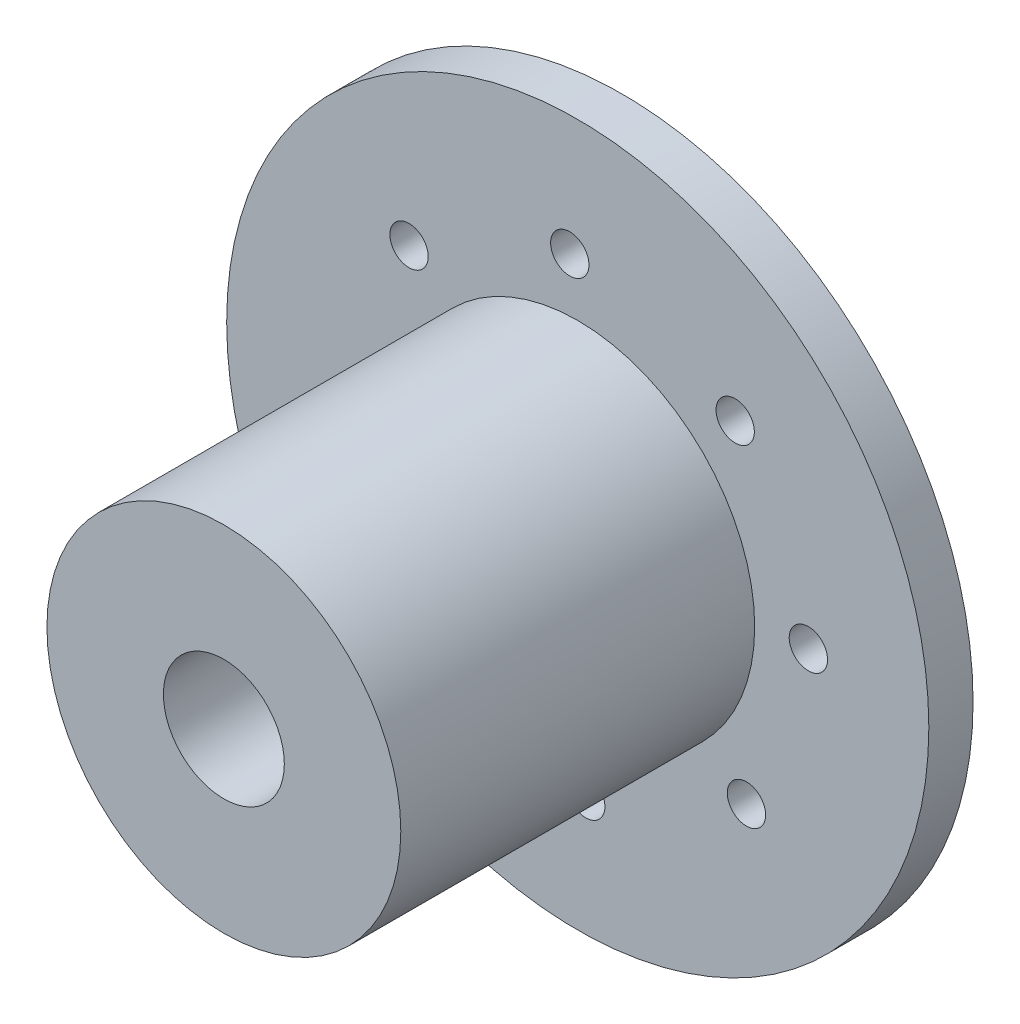
ISO-10303-21;
HEADER;
FILE_DESCRIPTION(('STEP AP214'),'2;1');
FILE_NAME('part.step','',(''),(''),'','','');
FILE_SCHEMA(('AUTOMOTIVE_DESIGN { 1 0 10303 214 1 1 1 1 }'));
ENDSEC;
DATA;
#1=APPLICATION_CONTEXT('core data for automotive mechanical design processes');
#2=APPLICATION_PROTOCOL_DEFINITION('international standard','automotive_design',2000,#1);
#3=PRODUCT_CONTEXT('',#1,'mechanical');
#4=PRODUCT('Part','Part','',(#3));
#5=PRODUCT_RELATED_PRODUCT_CATEGORY('part','',(#4));
#6=PRODUCT_DEFINITION_FORMATION('','',#4);
#7=PRODUCT_DEFINITION_CONTEXT('part definition',#1,'design');
#8=PRODUCT_DEFINITION('design','',#6,#7);
#9=PRODUCT_DEFINITION_SHAPE('','',#8);
#10=(LENGTH_UNIT() NAMED_UNIT(*) SI_UNIT(.MILLI.,.METRE.));
#11=(NAMED_UNIT(*) PLANE_ANGLE_UNIT() SI_UNIT($,.RADIAN.));
#12=(NAMED_UNIT(*) SI_UNIT($,.STERADIAN.) SOLID_ANGLE_UNIT());
#13=UNCERTAINTY_MEASURE_WITH_UNIT(LENGTH_MEASURE(1.E-05),#10,'distance_accuracy_value','');
#14=(GEOMETRIC_REPRESENTATION_CONTEXT(3) GLOBAL_UNCERTAINTY_ASSIGNED_CONTEXT((#13)) GLOBAL_UNIT_ASSIGNED_CONTEXT((#10,
#11,#12)) REPRESENTATION_CONTEXT('',''));
#15=CARTESIAN_POINT('',(0.,0.,0.));
#16=DIRECTION('',(0.,0.,1.));
#17=DIRECTION('',(1.,0.,0.));
#18=AXIS2_PLACEMENT_3D('',#15,#16,#17);
#19=CARTESIAN_POINT('',(0.,0.,10.));
#20=DIRECTION('',(0.,0.,-1.));
#21=DIRECTION('',(-1.,0.,0.));
#22=AXIS2_PLACEMENT_3D('',#19,#20,#21);
#23=CYLINDRICAL_SURFACE('',#22,0.4);
#24=CARTESIAN_POINT('',(0.,0.,9.));
#25=DIRECTION('',(0.,0.,1.));
#26=DIRECTION('',(1.,0.,0.));
#27=AXIS2_PLACEMENT_3D('',#24,#25,#26);
#28=CIRCLE('',#27,0.4);
#29=CARTESIAN_POINT('',(0.4,0.,9.));
#30=VERTEX_POINT('',#29);
#31=EDGE_CURVE('E99',#30,#30,#28,.T.);
#32=ORIENTED_EDGE('',*,*,#31,.T.);
#33=EDGE_LOOP('',(#32));
#34=FACE_BOUND('',#33,.T.);
#35=CARTESIAN_POINT('',(0.,0.,5.));
#36=DIRECTION('',(0.,0.,-1.));
#37=DIRECTION('',(-1.,0.,0.));
#38=AXIS2_PLACEMENT_3D('',#35,#36,#37);
#39=CIRCLE('',#38,0.4);
#40=CARTESIAN_POINT('',(-0.4,0.,5.));
#41=VERTEX_POINT('',#40);
#42=EDGE_CURVE('E47',#41,#41,#39,.F.);
#43=ORIENTED_EDGE('',*,*,#42,.F.);
#44=EDGE_LOOP('',(#43));
#45=FACE_BOUND('',#44,.T.);
#46=ADVANCED_FACE('F43',(#34,#45),#23,.F.);
#47=CARTESIAN_POINT('',(0.,0.,3.));
#48=DIRECTION('',(0.,0.,-1.));
#49=DIRECTION('',(-1.,0.,0.));
#50=AXIS2_PLACEMENT_3D('',#47,#48,#49);
#51=CYLINDRICAL_SURFACE('',#50,23.81);
#52=CARTESIAN_POINT('',(0.,0.,3.));
#53=DIRECTION('',(0.,0.,1.));
#54=DIRECTION('',(1.,0.,0.));
#55=AXIS2_PLACEMENT_3D('',#52,#53,#54);
#56=CIRCLE('',#55,23.81);
#57=CARTESIAN_POINT('',(23.81,0.,3.));
#58=VERTEX_POINT('',#57);
#59=EDGE_CURVE('E52',#58,#58,#56,.T.);
#60=ORIENTED_EDGE('',*,*,#59,.F.);
#61=EDGE_LOOP('',(#60));
#62=FACE_BOUND('',#61,.T.);
#63=CARTESIAN_POINT('',(0.,0.,0.));
#64=DIRECTION('',(0.,0.,1.));
#65=DIRECTION('',(1.,0.,0.));
#66=AXIS2_PLACEMENT_3D('',#63,#64,#65);
#67=CIRCLE('',#66,23.81);
#68=CARTESIAN_POINT('',(23.81,0.,0.));
#69=VERTEX_POINT('',#68);
#70=EDGE_CURVE('E58',#69,#69,#67,.T.);
#71=ORIENTED_EDGE('',*,*,#70,.T.);
#72=EDGE_LOOP('',(#71));
#73=FACE_BOUND('',#72,.T.);
#74=ADVANCED_FACE('F45',(#62,#73),#51,.T.);
#75=CARTESIAN_POINT('',(0.,0.,3.));
#76=DIRECTION('',(0.,0.,1.));
#77=DIRECTION('',(1.,0.,0.));
#78=AXIS2_PLACEMENT_3D('',#75,#76,#77);
#79=PLANE('',#78);
#80=CARTESIAN_POINT('',(-0.540954740765855,15.6406479395338,3.));
#81=DIRECTION('',(0.,0.,1.));
#82=DIRECTION('',(1.,0.,0.));
#83=AXIS2_PLACEMENT_3D('',#80,#81,#82);
#84=CIRCLE('',#83,1.3);
#85=CARTESIAN_POINT('',(0.759045259234146,15.6406479395338,3.));
#86=VERTEX_POINT('',#85);
#87=EDGE_CURVE('E140',#86,#86,#84,.T.);
#88=ORIENTED_EDGE('',*,*,#87,.F.);
#89=EDGE_LOOP('',(#88));
#90=FACE_BOUND('',#89,.T.);
#91=CARTESIAN_POINT('',(10.6770954546852,11.4421209857063,3.));
#92=DIRECTION('',(0.,0.,1.));
#93=DIRECTION('',(1.,0.,0.));
#94=AXIS2_PLACEMENT_3D('',#91,#92,#93);
#95=CIRCLE('',#94,1.3);
#96=CARTESIAN_POINT('',(11.9770954546852,11.4421209857063,3.));
#97=VERTEX_POINT('',#96);
#98=EDGE_CURVE('E144',#97,#97,#95,.T.);
#99=ORIENTED_EDGE('',*,*,#98,.F.);
#100=EDGE_LOOP('',(#99));
#101=FACE_BOUND('',#100,.T.);
#102=CARTESIAN_POINT('',(15.6406479395338,0.540954740765799,3.));
#103=DIRECTION('',(0.,0.,1.));
#104=DIRECTION('',(1.,0.,0.));
#105=AXIS2_PLACEMENT_3D('',#102,#103,#104);
#106=CIRCLE('',#105,1.3);
#107=CARTESIAN_POINT('',(16.9406479395338,0.540954740765799,3.));
#108=VERTEX_POINT('',#107);
#109=EDGE_CURVE('E148',#108,#108,#106,.T.);
#110=ORIENTED_EDGE('',*,*,#109,.F.);
#111=EDGE_LOOP('',(#110));
#112=FACE_BOUND('',#111,.T.);
#113=CARTESIAN_POINT('',(11.4421209857062,-10.6770954546853,3.));
#114=DIRECTION('',(0.,0.,1.));
#115=DIRECTION('',(1.,0.,0.));
#116=AXIS2_PLACEMENT_3D('',#113,#114,#115);
#117=CIRCLE('',#116,1.3);
#118=CARTESIAN_POINT('',(12.7421209857062,-10.6770954546853,3.));
#119=VERTEX_POINT('',#118);
#120=EDGE_CURVE('E132',#119,#119,#117,.T.);
#121=ORIENTED_EDGE('',*,*,#120,.F.);
#122=EDGE_LOOP('',(#121));
#123=FACE_BOUND('',#122,.T.);
#124=CARTESIAN_POINT('',(0.540954740765749,-15.6406479395338,3.));
#125=DIRECTION('',(0.,0.,1.));
#126=DIRECTION('',(1.,0.,0.));
#127=AXIS2_PLACEMENT_3D('',#124,#125,#126);
#128=CIRCLE('',#127,1.3);
#129=CARTESIAN_POINT('',(1.84095474076575,-15.6406479395338,3.));
#130=VERTEX_POINT('',#129);
#131=EDGE_CURVE('E128',#130,#130,#128,.T.);
#132=ORIENTED_EDGE('',*,*,#131,.F.);
#133=EDGE_LOOP('',(#132));
#134=FACE_BOUND('',#133,.T.);
#135=CARTESIAN_POINT('',(-10.6770954546853,-11.4421209857062,3.));
#136=DIRECTION('',(0.,0.,1.));
#137=DIRECTION('',(1.,0.,0.));
#138=AXIS2_PLACEMENT_3D('',#135,#136,#137);
#139=CIRCLE('',#138,1.3);
#140=CARTESIAN_POINT('',(-9.37709545468531,-11.4421209857062,3.));
#141=VERTEX_POINT('',#140);
#142=EDGE_CURVE('E133',#141,#141,#139,.T.);
#143=ORIENTED_EDGE('',*,*,#142,.F.);
#144=EDGE_LOOP('',(#143));
#145=FACE_BOUND('',#144,.T.);
#146=CARTESIAN_POINT('',(-15.6406479395338,-0.540954740765689,3.));
#147=DIRECTION('',(0.,0.,1.));
#148=DIRECTION('',(1.,0.,0.));
#149=AXIS2_PLACEMENT_3D('',#146,#147,#148);
#150=CIRCLE('',#149,1.3);
#151=CARTESIAN_POINT('',(-14.3406479395338,-0.540954740765689,3.));
#152=VERTEX_POINT('',#151);
#153=EDGE_CURVE('E126',#152,#152,#150,.T.);
#154=ORIENTED_EDGE('',*,*,#153,.F.);
#155=EDGE_LOOP('',(#154));
#156=FACE_BOUND('',#155,.T.);
#157=CARTESIAN_POINT('',(-11.4421209857063,10.6770954546852,3.));
#158=DIRECTION('',(0.,0.,1.));
#159=DIRECTION('',(1.,0.,0.));
#160=AXIS2_PLACEMENT_3D('',#157,#158,#159);
#161=CIRCLE('',#160,1.3);
#162=CARTESIAN_POINT('',(-10.1421209857063,10.6770954546852,3.));
#163=VERTEX_POINT('',#162);
#164=EDGE_CURVE('E72',#163,#163,#161,.T.);
#165=ORIENTED_EDGE('',*,*,#164,.F.);
#166=EDGE_LOOP('',(#165));
#167=FACE_BOUND('',#166,.T.);
#168=CARTESIAN_POINT('',(0.,0.,3.));
#169=DIRECTION('',(0.,0.,1.));
#170=DIRECTION('',(1.,0.,0.));
#171=AXIS2_PLACEMENT_3D('',#168,#169,#170);
#172=CIRCLE('',#171,12.);
#173=CARTESIAN_POINT('',(12.,0.,3.));
#174=VERTEX_POINT('',#173);
#175=EDGE_CURVE('E10',#174,#174,#172,.T.);
#176=ORIENTED_EDGE('',*,*,#175,.F.);
#177=EDGE_LOOP('',(#176));
#178=FACE_BOUND('',#177,.T.);
#179=ORIENTED_EDGE('',*,*,#59,.T.);
#180=EDGE_LOOP('',(#179));
#181=FACE_BOUND('',#180,.T.);
#182=ADVANCED_FACE('F161',(#90,#101,#112,#123,#134,#145,#156,#167,#178,#181),#79,.T.);
#183=CARTESIAN_POINT('',(0.,0.,0.));
#184=DIRECTION('',(0.,0.,1.));
#185=DIRECTION('',(1.,0.,0.));
#186=AXIS2_PLACEMENT_3D('',#183,#184,#185);
#187=PLANE('',#186);
#188=CARTESIAN_POINT('',(0.,0.,0.));
#189=DIRECTION('',(0.,0.,-1.));
#190=DIRECTION('',(-1.,0.,0.));
#191=AXIS2_PLACEMENT_3D('',#188,#189,#190);
#192=CIRCLE('',#191,4.1);
#193=CARTESIAN_POINT('',(-4.1,0.,0.));
#194=VERTEX_POINT('',#193);
#195=EDGE_CURVE('E116',#194,#194,#192,.T.);
#196=ORIENTED_EDGE('',*,*,#195,.F.);
#197=EDGE_LOOP('',(#196));
#198=FACE_BOUND('',#197,.T.);
#199=CARTESIAN_POINT('',(-0.540954740765855,15.6406479395338,0.));
#200=DIRECTION('',(0.,0.,1.));
#201=DIRECTION('',(1.,0.,0.));
#202=AXIS2_PLACEMENT_3D('',#199,#200,#201);
#203=CIRCLE('',#202,1.3);
#204=CARTESIAN_POINT('',(0.759045259234146,15.6406479395338,0.));
#205=VERTEX_POINT('',#204);
#206=EDGE_CURVE('E96',#205,#205,#203,.T.);
#207=ORIENTED_EDGE('',*,*,#206,.T.);
#208=EDGE_LOOP('',(#207));
#209=FACE_BOUND('',#208,.T.);
#210=CARTESIAN_POINT('',(10.6770954546852,11.4421209857063,0.));
#211=DIRECTION('',(0.,0.,1.));
#212=DIRECTION('',(1.,0.,0.));
#213=AXIS2_PLACEMENT_3D('',#210,#211,#212);
#214=CIRCLE('',#213,1.3);
#215=CARTESIAN_POINT('',(11.9770954546852,11.4421209857063,0.));
#216=VERTEX_POINT('',#215);
#217=EDGE_CURVE('E92',#216,#216,#214,.T.);
#218=ORIENTED_EDGE('',*,*,#217,.T.);
#219=EDGE_LOOP('',(#218));
#220=FACE_BOUND('',#219,.T.);
#221=CARTESIAN_POINT('',(15.6406479395338,0.540954740765799,0.));
#222=DIRECTION('',(0.,0.,1.));
#223=DIRECTION('',(1.,0.,0.));
#224=AXIS2_PLACEMENT_3D('',#221,#222,#223);
#225=CIRCLE('',#224,1.3);
#226=CARTESIAN_POINT('',(16.9406479395338,0.540954740765799,0.));
#227=VERTEX_POINT('',#226);
#228=EDGE_CURVE('E88',#227,#227,#225,.T.);
#229=ORIENTED_EDGE('',*,*,#228,.T.);
#230=EDGE_LOOP('',(#229));
#231=FACE_BOUND('',#230,.T.);
#232=CARTESIAN_POINT('',(11.4421209857062,-10.6770954546853,0.));
#233=DIRECTION('',(0.,0.,1.));
#234=DIRECTION('',(1.,0.,0.));
#235=AXIS2_PLACEMENT_3D('',#232,#233,#234);
#236=CIRCLE('',#235,1.3);
#237=CARTESIAN_POINT('',(12.7421209857062,-10.6770954546853,0.));
#238=VERTEX_POINT('',#237);
#239=EDGE_CURVE('E84',#238,#238,#236,.T.);
#240=ORIENTED_EDGE('',*,*,#239,.T.);
#241=EDGE_LOOP('',(#240));
#242=FACE_BOUND('',#241,.T.);
#243=CARTESIAN_POINT('',(0.540954740765749,-15.6406479395338,0.));
#244=DIRECTION('',(0.,0.,1.));
#245=DIRECTION('',(1.,0.,0.));
#246=AXIS2_PLACEMENT_3D('',#243,#244,#245);
#247=CIRCLE('',#246,1.3);
#248=CARTESIAN_POINT('',(1.84095474076575,-15.6406479395338,0.));
#249=VERTEX_POINT('',#248);
#250=EDGE_CURVE('E80',#249,#249,#247,.T.);
#251=ORIENTED_EDGE('',*,*,#250,.T.);
#252=EDGE_LOOP('',(#251));
#253=FACE_BOUND('',#252,.T.);
#254=CARTESIAN_POINT('',(-10.6770954546853,-11.4421209857062,0.));
#255=DIRECTION('',(0.,0.,1.));
#256=DIRECTION('',(1.,0.,0.));
#257=AXIS2_PLACEMENT_3D('',#254,#255,#256);
#258=CIRCLE('',#257,1.3);
#259=CARTESIAN_POINT('',(-9.37709545468531,-11.4421209857062,0.));
#260=VERTEX_POINT('',#259);
#261=EDGE_CURVE('E76',#260,#260,#258,.T.);
#262=ORIENTED_EDGE('',*,*,#261,.T.);
#263=EDGE_LOOP('',(#262));
#264=FACE_BOUND('',#263,.T.);
#265=CARTESIAN_POINT('',(-15.6406479395338,-0.540954740765689,0.));
#266=DIRECTION('',(0.,0.,1.));
#267=DIRECTION('',(1.,0.,0.));
#268=AXIS2_PLACEMENT_3D('',#265,#266,#267);
#269=CIRCLE('',#268,1.3);
#270=CARTESIAN_POINT('',(-14.3406479395338,-0.540954740765689,0.));
#271=VERTEX_POINT('',#270);
#272=EDGE_CURVE('E71',#271,#271,#269,.T.);
#273=ORIENTED_EDGE('',*,*,#272,.T.);
#274=EDGE_LOOP('',(#273));
#275=FACE_BOUND('',#274,.T.);
#276=CARTESIAN_POINT('',(-11.4421209857063,10.6770954546852,0.));
#277=DIRECTION('',(0.,0.,1.));
#278=DIRECTION('',(1.,0.,0.));
#279=AXIS2_PLACEMENT_3D('',#276,#277,#278);
#280=CIRCLE('',#279,1.3);
#281=CARTESIAN_POINT('',(-10.1421209857063,10.6770954546852,0.));
#282=VERTEX_POINT('',#281);
#283=EDGE_CURVE('E67',#282,#282,#280,.T.);
#284=ORIENTED_EDGE('',*,*,#283,.T.);
#285=EDGE_LOOP('',(#284));
#286=FACE_BOUND('',#285,.T.);
#287=ORIENTED_EDGE('',*,*,#70,.F.);
#288=EDGE_LOOP('',(#287));
#289=FACE_BOUND('',#288,.T.);
#290=ADVANCED_FACE('F164',(#198,#209,#220,#231,#242,#253,#264,#275,#286,#289),#187,.F.);
#291=CARTESIAN_POINT('',(0.,0.,27.));
#292=DIRECTION('',(0.,0.,-1.));
#293=DIRECTION('',(-1.,0.,0.));
#294=AXIS2_PLACEMENT_3D('',#291,#292,#293);
#295=CYLINDRICAL_SURFACE('',#294,12.);
#296=CARTESIAN_POINT('',(0.,0.,27.));
#297=DIRECTION('',(0.,0.,1.));
#298=DIRECTION('',(1.,0.,0.));
#299=AXIS2_PLACEMENT_3D('',#296,#297,#298);
#300=CIRCLE('',#299,12.);
#301=CARTESIAN_POINT('',(12.,0.,27.));
#302=VERTEX_POINT('',#301);
#303=EDGE_CURVE('E61',#302,#302,#300,.T.);
#304=ORIENTED_EDGE('',*,*,#303,.F.);
#305=EDGE_LOOP('',(#304));
#306=FACE_BOUND('',#305,.T.);
#307=ORIENTED_EDGE('',*,*,#175,.T.);
#308=EDGE_LOOP('',(#307));
#309=FACE_BOUND('',#308,.T.);
#310=ADVANCED_FACE('F175',(#306,#309),#295,.T.);
#311=CARTESIAN_POINT('',(0.,0.,27.));
#312=DIRECTION('',(0.,0.,1.));
#313=DIRECTION('',(1.,0.,0.));
#314=AXIS2_PLACEMENT_3D('',#311,#312,#313);
#315=PLANE('',#314);
#316=CARTESIAN_POINT('',(0.,0.,27.));
#317=DIRECTION('',(0.,0.,1.));
#318=DIRECTION('',(1.,0.,0.));
#319=AXIS2_PLACEMENT_3D('',#316,#317,#318);
#320=CIRCLE('',#319,4.1);
#321=CARTESIAN_POINT('',(4.1,0.,27.));
#322=VERTEX_POINT('',#321);
#323=EDGE_CURVE('E102',#322,#322,#320,.T.);
#324=ORIENTED_EDGE('',*,*,#323,.F.);
#325=EDGE_LOOP('',(#324));
#326=FACE_BOUND('',#325,.T.);
#327=ORIENTED_EDGE('',*,*,#303,.T.);
#328=EDGE_LOOP('',(#327));
#329=FACE_BOUND('',#328,.T.);
#330=ADVANCED_FACE('F182',(#326,#329),#315,.T.);
#331=CARTESIAN_POINT('',(-11.4421209857063,10.6770954546852,-21.));
#332=DIRECTION('',(0.,0.,1.));
#333=DIRECTION('',(1.,0.,0.));
#334=AXIS2_PLACEMENT_3D('',#331,#332,#333);
#335=CYLINDRICAL_SURFACE('',#334,1.3);
#336=ORIENTED_EDGE('',*,*,#164,.T.);
#337=EDGE_LOOP('',(#336));
#338=FACE_BOUND('',#337,.T.);
#339=ORIENTED_EDGE('',*,*,#283,.F.);
#340=EDGE_LOOP('',(#339));
#341=FACE_BOUND('',#340,.T.);
#342=ADVANCED_FACE('F158',(#338,#341),#335,.F.);
#343=CARTESIAN_POINT('',(-15.6406479395338,-0.540954740765689,-21.));
#344=DIRECTION('',(0.,0.,1.));
#345=DIRECTION('',(1.,0.,0.));
#346=AXIS2_PLACEMENT_3D('',#343,#344,#345);
#347=CYLINDRICAL_SURFACE('',#346,1.3);
#348=ORIENTED_EDGE('',*,*,#153,.T.);
#349=EDGE_LOOP('',(#348));
#350=FACE_BOUND('',#349,.T.);
#351=ORIENTED_EDGE('',*,*,#272,.F.);
#352=EDGE_LOOP('',(#351));
#353=FACE_BOUND('',#352,.T.);
#354=ADVANCED_FACE('F213',(#350,#353),#347,.F.);
#355=CARTESIAN_POINT('',(-10.6770954546853,-11.4421209857062,-21.));
#356=DIRECTION('',(0.,0.,1.));
#357=DIRECTION('',(1.,0.,0.));
#358=AXIS2_PLACEMENT_3D('',#355,#356,#357);
#359=CYLINDRICAL_SURFACE('',#358,1.3);
#360=ORIENTED_EDGE('',*,*,#142,.T.);
#361=EDGE_LOOP('',(#360));
#362=FACE_BOUND('',#361,.T.);
#363=ORIENTED_EDGE('',*,*,#261,.F.);
#364=EDGE_LOOP('',(#363));
#365=FACE_BOUND('',#364,.T.);
#366=ADVANCED_FACE('F209',(#362,#365),#359,.F.);
#367=CARTESIAN_POINT('',(0.540954740765749,-15.6406479395338,-21.));
#368=DIRECTION('',(0.,0.,1.));
#369=DIRECTION('',(1.,0.,0.));
#370=AXIS2_PLACEMENT_3D('',#367,#368,#369);
#371=CYLINDRICAL_SURFACE('',#370,1.3);
#372=ORIENTED_EDGE('',*,*,#131,.T.);
#373=EDGE_LOOP('',(#372));
#374=FACE_BOUND('',#373,.T.);
#375=ORIENTED_EDGE('',*,*,#250,.F.);
#376=EDGE_LOOP('',(#375));
#377=FACE_BOUND('',#376,.T.);
#378=ADVANCED_FACE('F205',(#374,#377),#371,.F.);
#379=CARTESIAN_POINT('',(11.4421209857062,-10.6770954546853,-21.));
#380=DIRECTION('',(0.,0.,1.));
#381=DIRECTION('',(1.,0.,0.));
#382=AXIS2_PLACEMENT_3D('',#379,#380,#381);
#383=CYLINDRICAL_SURFACE('',#382,1.3);
#384=ORIENTED_EDGE('',*,*,#120,.T.);
#385=EDGE_LOOP('',(#384));
#386=FACE_BOUND('',#385,.T.);
#387=ORIENTED_EDGE('',*,*,#239,.F.);
#388=EDGE_LOOP('',(#387));
#389=FACE_BOUND('',#388,.T.);
#390=ADVANCED_FACE('F208',(#386,#389),#383,.F.);
#391=CARTESIAN_POINT('',(15.6406479395338,0.540954740765799,-21.));
#392=DIRECTION('',(0.,0.,1.));
#393=DIRECTION('',(1.,0.,0.));
#394=AXIS2_PLACEMENT_3D('',#391,#392,#393);
#395=CYLINDRICAL_SURFACE('',#394,1.3);
#396=ORIENTED_EDGE('',*,*,#109,.T.);
#397=EDGE_LOOP('',(#396));
#398=FACE_BOUND('',#397,.T.);
#399=ORIENTED_EDGE('',*,*,#228,.F.);
#400=EDGE_LOOP('',(#399));
#401=FACE_BOUND('',#400,.T.);
#402=ADVANCED_FACE('F224',(#398,#401),#395,.F.);
#403=CARTESIAN_POINT('',(10.6770954546852,11.4421209857063,-21.));
#404=DIRECTION('',(0.,0.,1.));
#405=DIRECTION('',(1.,0.,0.));
#406=AXIS2_PLACEMENT_3D('',#403,#404,#405);
#407=CYLINDRICAL_SURFACE('',#406,1.3);
#408=ORIENTED_EDGE('',*,*,#98,.T.);
#409=EDGE_LOOP('',(#408));
#410=FACE_BOUND('',#409,.T.);
#411=ORIENTED_EDGE('',*,*,#217,.F.);
#412=EDGE_LOOP('',(#411));
#413=FACE_BOUND('',#412,.T.);
#414=ADVANCED_FACE('F220',(#410,#413),#407,.F.);
#415=CARTESIAN_POINT('',(-0.540954740765855,15.6406479395338,-21.));
#416=DIRECTION('',(0.,0.,1.));
#417=DIRECTION('',(1.,0.,0.));
#418=AXIS2_PLACEMENT_3D('',#415,#416,#417);
#419=CYLINDRICAL_SURFACE('',#418,1.3);
#420=ORIENTED_EDGE('',*,*,#87,.T.);
#421=EDGE_LOOP('',(#420));
#422=FACE_BOUND('',#421,.T.);
#423=ORIENTED_EDGE('',*,*,#206,.F.);
#424=EDGE_LOOP('',(#423));
#425=FACE_BOUND('',#424,.T.);
#426=ADVANCED_FACE('F203',(#422,#425),#419,.F.);
#427=CARTESIAN_POINT('',(0.,0.,9.));
#428=DIRECTION('',(0.,0.,1.));
#429=DIRECTION('',(1.,0.,0.));
#430=AXIS2_PLACEMENT_3D('',#427,#428,#429);
#431=CYLINDRICAL_SURFACE('',#430,4.1);
#432=CARTESIAN_POINT('',(0.,0.,9.));
#433=DIRECTION('',(0.,0.,1.));
#434=DIRECTION('',(1.,0.,0.));
#435=AXIS2_PLACEMENT_3D('',#432,#433,#434);
#436=CIRCLE('',#435,4.1);
#437=CARTESIAN_POINT('',(4.1,0.,9.));
#438=VERTEX_POINT('',#437);
#439=EDGE_CURVE('E108',#438,#438,#436,.T.);
#440=ORIENTED_EDGE('',*,*,#439,.F.);
#441=EDGE_LOOP('',(#440));
#442=FACE_BOUND('',#441,.T.);
#443=ORIENTED_EDGE('',*,*,#323,.T.);
#444=EDGE_LOOP('',(#443));
#445=FACE_BOUND('',#444,.T.);
#446=ADVANCED_FACE('F199',(#442,#445),#431,.F.);
#447=CARTESIAN_POINT('',(0.,0.,9.));
#448=DIRECTION('',(0.,0.,1.));
#449=DIRECTION('',(1.,0.,0.));
#450=AXIS2_PLACEMENT_3D('',#447,#448,#449);
#451=PLANE('',#450);
#452=ORIENTED_EDGE('',*,*,#31,.F.);
#453=EDGE_LOOP('',(#452));
#454=FACE_BOUND('',#453,.T.);
#455=ORIENTED_EDGE('',*,*,#439,.T.);
#456=EDGE_LOOP('',(#455));
#457=FACE_BOUND('',#456,.T.);
#458=ADVANCED_FACE('F196',(#454,#457),#451,.T.);
#459=CARTESIAN_POINT('',(0.,0.,5.));
#460=DIRECTION('',(0.,0.,-1.));
#461=DIRECTION('',(-1.,0.,0.));
#462=AXIS2_PLACEMENT_3D('',#459,#460,#461);
#463=PLANE('',#462);
#464=CARTESIAN_POINT('',(0.,0.,5.));
#465=DIRECTION('',(0.,0.,-1.));
#466=DIRECTION('',(-1.,0.,0.));
#467=AXIS2_PLACEMENT_3D('',#464,#465,#466);
#468=CIRCLE('',#467,4.1);
#469=CARTESIAN_POINT('',(-4.1,0.,5.));
#470=VERTEX_POINT('',#469);
#471=EDGE_CURVE('E111',#470,#470,#468,.T.);
#472=ORIENTED_EDGE('',*,*,#471,.T.);
#473=EDGE_LOOP('',(#472));
#474=FACE_BOUND('',#473,.T.);
#475=ORIENTED_EDGE('',*,*,#42,.T.);
#476=EDGE_LOOP('',(#475));
#477=FACE_BOUND('',#476,.T.);
#478=ADVANCED_FACE('F198',(#474,#477),#463,.T.);
#479=CARTESIAN_POINT('',(0.,0.,5.));
#480=DIRECTION('',(0.,0.,-1.));
#481=DIRECTION('',(-1.,0.,0.));
#482=AXIS2_PLACEMENT_3D('',#479,#480,#481);
#483=CYLINDRICAL_SURFACE('',#482,4.1);
#484=ORIENTED_EDGE('',*,*,#471,.F.);
#485=EDGE_LOOP('',(#484));
#486=FACE_BOUND('',#485,.T.);
#487=ORIENTED_EDGE('',*,*,#195,.T.);
#488=EDGE_LOOP('',(#487));
#489=FACE_BOUND('',#488,.T.);
#490=ADVANCED_FACE('F194',(#486,#489),#483,.F.);
#491=CLOSED_SHELL('',(#46,#74,#182,#290,#310,#330,#342,#354,#366,#378,#390,#402,#414,#426,#446,
#458,#478,#490));
#492=MANIFOLD_SOLID_BREP('B2',#491);
#493=ADVANCED_BREP_SHAPE_REPRESENTATION('',(#18,#492),#14);
#494=SHAPE_DEFINITION_REPRESENTATION(#9,#493);
ENDSEC;
END-ISO-10303-21;
